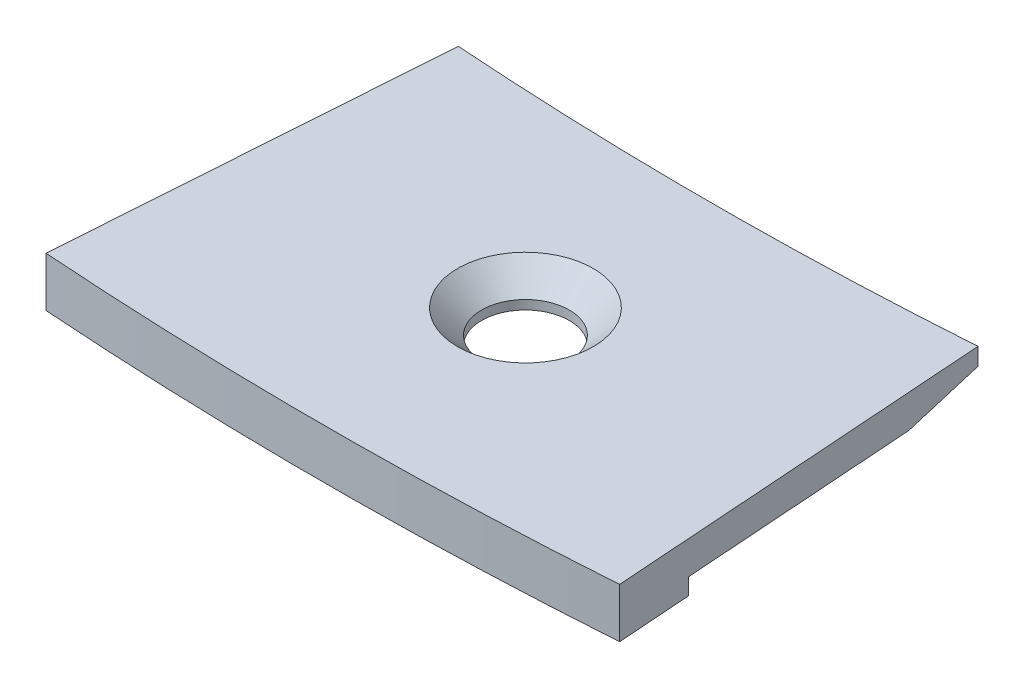
ISO-10303-21;
HEADER;
FILE_DESCRIPTION(('STEP AP214'),'2;1');
FILE_NAME('part.step','',(''),(''),'','','');
FILE_SCHEMA(('AUTOMOTIVE_DESIGN { 1 0 10303 214 1 1 1 1 }'));
ENDSEC;
DATA;
#1=APPLICATION_CONTEXT('core data for automotive mechanical design processes');
#2=APPLICATION_PROTOCOL_DEFINITION('international standard','automotive_design',2000,#1);
#3=PRODUCT_CONTEXT('',#1,'mechanical');
#4=PRODUCT('Part','Part','',(#3));
#5=PRODUCT_RELATED_PRODUCT_CATEGORY('part','',(#4));
#6=PRODUCT_DEFINITION_FORMATION('','',#4);
#7=PRODUCT_DEFINITION_CONTEXT('part definition',#1,'design');
#8=PRODUCT_DEFINITION('design','',#6,#7);
#9=PRODUCT_DEFINITION_SHAPE('','',#8);
#10=(LENGTH_UNIT() NAMED_UNIT(*) SI_UNIT(.MILLI.,.METRE.));
#11=(NAMED_UNIT(*) PLANE_ANGLE_UNIT() SI_UNIT($,.RADIAN.));
#12=(NAMED_UNIT(*) SI_UNIT($,.STERADIAN.) SOLID_ANGLE_UNIT());
#13=UNCERTAINTY_MEASURE_WITH_UNIT(LENGTH_MEASURE(1.E-05),#10,'distance_accuracy_value','');
#14=(GEOMETRIC_REPRESENTATION_CONTEXT(3) GLOBAL_UNCERTAINTY_ASSIGNED_CONTEXT((#13)) GLOBAL_UNIT_ASSIGNED_CONTEXT((#10,
#11,#12)) REPRESENTATION_CONTEXT('',''));
#15=CARTESIAN_POINT('',(0.,0.,0.));
#16=DIRECTION('',(0.,0.,1.));
#17=DIRECTION('',(1.,0.,0.));
#18=AXIS2_PLACEMENT_3D('',#15,#16,#17);
#19=CARTESIAN_POINT('',(-4.35114280077257E-12,0.,3.66381025475767E-12));
#20=DIRECTION('',(0.,-1.,0.));
#21=DIRECTION('',(0.,0.,-1.));
#22=AXIS2_PLACEMENT_3D('',#19,#20,#21);
#23=PLANE('',#22);
#24=CARTESIAN_POINT('',(0.,0.,236.25));
#25=DIRECTION('',(0.,1.,0.));
#26=DIRECTION('',(0.,0.,1.));
#27=AXIS2_PLACEMENT_3D('',#24,#25,#26);
#28=CIRCLE('',#27,2.65);
#29=CARTESIAN_POINT('',(0.,0.,238.9));
#30=VERTEX_POINT('',#29);
#31=EDGE_CURVE('E129',#30,#30,#28,.T.);
#32=ORIENTED_EDGE('',*,*,#31,.T.);
#33=EDGE_LOOP('',(#32));
#34=FACE_BOUND('',#33,.T.);
#35=CARTESIAN_POINT('',(0.,0.,0.));
#36=DIRECTION('',(0.,1.,0.));
#37=DIRECTION('',(0.,0.,1.));
#38=AXIS2_PLACEMENT_3D('',#35,#36,#37);
#39=CIRCLE('',#38,244.);
#40=CARTESIAN_POINT('',(-17.0205795935663,0.,243.405628263397));
#41=VERTEX_POINT('',#40);
#42=CARTESIAN_POINT('',(17.0205795935667,0.,243.405628263397));
#43=VERTEX_POINT('',#42);
#44=EDGE_CURVE('E53',#41,#43,#39,.T.);
#45=ORIENTED_EDGE('',*,*,#44,.F.);
#46=DIRECTION('',(-0.0697564737441075,0.,0.997564050259826));
#47=VECTOR('',#46,1.);
#48=CARTESIAN_POINT('',(-15.9846959584666,0.,228.591802117042));
#49=LINE('',#48,#47);
#50=CARTESIAN_POINT('',(-16.0195741953386,0.,229.090584142172));
#51=VERTEX_POINT('',#50);
#52=EDGE_CURVE('E133',#51,#41,#49,.T.);
#53=ORIENTED_EDGE('',*,*,#52,.F.);
#54=CARTESIAN_POINT('',(0.,0.,0.));
#55=DIRECTION('',(0.,-1.,0.));
#56=DIRECTION('',(0.,0.,-1.));
#57=AXIS2_PLACEMENT_3D('',#54,#55,#56);
#58=CIRCLE('',#57,229.650000000004);
#59=CARTESIAN_POINT('',(16.0195741953387,0.,229.090584142172));
#60=VERTEX_POINT('',#59);
#61=EDGE_CURVE('E46',#51,#60,#58,.F.);
#62=ORIENTED_EDGE('',*,*,#61,.T.);
#63=DIRECTION('',(-0.0697564737441094,0.,-0.997564050259825));
#64=VECTOR('',#63,1.);
#65=CARTESIAN_POINT('',(15.9846959584666,0.,228.591802117042));
#66=LINE('',#65,#64);
#67=EDGE_CURVE('E59',#43,#60,#66,.T.);
#68=ORIENTED_EDGE('',*,*,#67,.F.);
#69=EDGE_LOOP('',(#45,#53,#62,#68));
#70=FACE_BOUND('',#69,.T.);
#71=ADVANCED_FACE('F37',(#34,#70),#23,.T.);
#72=CARTESIAN_POINT('',(-4.35114280077257E-12,2.,3.66381025475767E-12));
#73=DIRECTION('',(0.,-1.,0.));
#74=DIRECTION('',(0.,0.,-1.));
#75=AXIS2_PLACEMENT_3D('',#72,#73,#74);
#76=PLANE('',#75);
#77=CARTESIAN_POINT('',(0.,2.,236.25));
#78=DIRECTION('',(0.,1.,0.));
#79=DIRECTION('',(0.,0.,1.));
#80=AXIS2_PLACEMENT_3D('',#77,#78,#79);
#81=CIRCLE('',#80,4.1);
#82=CARTESIAN_POINT('',(0.,2.,240.35));
#83=VERTEX_POINT('',#82);
#84=EDGE_CURVE('E170',#83,#83,#81,.T.);
#85=ORIENTED_EDGE('',*,*,#84,.F.);
#86=EDGE_LOOP('',(#85));
#87=FACE_BOUND('',#86,.T.);
#88=DIRECTION('',(-0.0697564737441094,0.,-0.997564050259825));
#89=VECTOR('',#88,1.);
#90=CARTESIAN_POINT('',(15.9846959584666,2.,228.591802117042));
#91=LINE('',#90,#89);
#92=CARTESIAN_POINT('',(17.3344837254152,2.,247.894666489571));
#93=VERTEX_POINT('',#92);
#94=CARTESIAN_POINT('',(15.7056700634855,2.,224.601545916003));
#95=VERTEX_POINT('',#94);
#96=EDGE_CURVE('E138',#93,#95,#91,.T.);
#97=ORIENTED_EDGE('',*,*,#96,.T.);
#98=CARTESIAN_POINT('',(0.,2.,0.));
#99=DIRECTION('',(0.,-1.,0.));
#100=DIRECTION('',(0.,0.,-1.));
#101=AXIS2_PLACEMENT_3D('',#98,#99,#100);
#102=CIRCLE('',#101,225.150000000004);
#103=CARTESIAN_POINT('',(-15.7056700634945,2.,224.601545916003));
#104=VERTEX_POINT('',#103);
#105=EDGE_CURVE('E118',#95,#104,#102,.T.);
#106=ORIENTED_EDGE('',*,*,#105,.T.);
#107=DIRECTION('',(-0.0697564737441075,0.,0.997564050259826));
#108=VECTOR('',#107,1.);
#109=CARTESIAN_POINT('',(-15.9846959584666,2.,228.591802117042));
#110=LINE('',#109,#108);
#111=CARTESIAN_POINT('',(-17.3344837254152,2.,247.894666489571));
#112=VERTEX_POINT('',#111);
#113=EDGE_CURVE('E134',#104,#112,#110,.T.);
#114=ORIENTED_EDGE('',*,*,#113,.T.);
#115=CARTESIAN_POINT('',(-4.6074255521944E-12,2.,0.));
#116=DIRECTION('',(0.,1.,0.));
#117=DIRECTION('',(0.,0.,-1.));
#118=AXIS2_PLACEMENT_3D('',#115,#116,#117);
#119=CIRCLE('',#118,248.500000000005);
#120=EDGE_CURVE('E136',#112,#93,#119,.T.);
#121=ORIENTED_EDGE('',*,*,#120,.T.);
#122=EDGE_LOOP('',(#97,#106,#114,#121));
#123=FACE_BOUND('',#122,.T.);
#124=ADVANCED_FACE('F161',(#87,#123),#76,.F.);
#125=CARTESIAN_POINT('',(-15.9846959584666,2.,228.591802117042));
#126=DIRECTION('',(0.997564050259826,0.,0.0697564737441075));
#127=DIRECTION('',(0.0697564737441075,0.,-0.997564050259826));
#128=AXIS2_PLACEMENT_3D('',#125,#126,#127);
#129=PLANE('',#128);
#130=DIRECTION('',(0.,1.,0.));
#131=VECTOR('',#130,1.);
#132=CARTESIAN_POINT('',(-15.7056700634945,0.,224.601545916003));
#133=LINE('',#132,#131);
#134=CARTESIAN_POINT('',(-15.7056700634945,0.956504527515105,224.601545916003));
#135=VERTEX_POINT('',#134);
#136=EDGE_CURVE('E127',#135,#104,#133,.T.);
#137=ORIENTED_EDGE('',*,*,#136,.F.);
#138=DIRECTION('',(-0.0682321274284495,-0.207911690817758,0.975764882339946));
#139=VECTOR('',#138,1.);
#140=CARTESIAN_POINT('',(-4.09781873540611E-12,48.813614387521,-2.86547400089263E-13));
#141=LINE('',#140,#139);
#142=EDGE_CURVE('E149',#135,#51,#141,.T.);
#143=ORIENTED_EDGE('',*,*,#142,.T.);
#144=ORIENTED_EDGE('',*,*,#52,.T.);
#145=DIRECTION('',(0.,1.,0.));
#146=VECTOR('',#145,1.);
#147=CARTESIAN_POINT('',(-17.0205795935663,-1.,243.405628263397));
#148=LINE('',#147,#146);
#149=CARTESIAN_POINT('',(-17.0205795935663,-1.,243.405628263397));
#150=VERTEX_POINT('',#149);
#151=EDGE_CURVE('E119',#150,#41,#148,.T.);
#152=ORIENTED_EDGE('',*,*,#151,.F.);
#153=DIRECTION('',(0.0697564737441093,0.,-0.997564050259826));
#154=VECTOR('',#153,1.);
#155=CARTESIAN_POINT('',(-17.3344837254152,-1.,247.894666489571));
#156=LINE('',#155,#154);
#157=CARTESIAN_POINT('',(-17.3344837254152,-1.,247.894666489571));
#158=VERTEX_POINT('',#157);
#159=EDGE_CURVE('E112',#158,#150,#156,.T.);
#160=ORIENTED_EDGE('',*,*,#159,.F.);
#161=DIRECTION('',(0.,-1.,0.));
#162=VECTOR('',#161,1.);
#163=CARTESIAN_POINT('',(-17.3344837254152,2.,247.894666489571));
#164=LINE('',#163,#162);
#165=EDGE_CURVE('E144',#112,#158,#164,.T.);
#166=ORIENTED_EDGE('',*,*,#165,.F.);
#167=ORIENTED_EDGE('',*,*,#113,.F.);
#168=EDGE_LOOP('',(#137,#143,#144,#152,#160,#166,#167));
#169=FACE_BOUND('',#168,.T.);
#170=ADVANCED_FACE('F181',(#169),#129,.F.);
#171=CARTESIAN_POINT('',(-4.6074255521944E-12,2.,0.));
#172=DIRECTION('',(0.,-1.,0.));
#173=DIRECTION('',(0.,0.,-1.));
#174=AXIS2_PLACEMENT_3D('',#171,#172,#173);
#175=CYLINDRICAL_SURFACE('',#174,248.500000000005);
#176=ORIENTED_EDGE('',*,*,#165,.T.);
#177=CARTESIAN_POINT('',(0.,-1.,0.));
#178=DIRECTION('',(0.,-1.,0.));
#179=DIRECTION('',(0.,0.,1.));
#180=AXIS2_PLACEMENT_3D('',#177,#178,#179);
#181=CIRCLE('',#180,248.500000000005);
#182=CARTESIAN_POINT('',(17.3344837254153,-1.,247.894666489571));
#183=VERTEX_POINT('',#182);
#184=EDGE_CURVE('E106',#183,#158,#181,.T.);
#185=ORIENTED_EDGE('',*,*,#184,.F.);
#186=DIRECTION('',(0.,-1.,0.));
#187=VECTOR('',#186,1.);
#188=CARTESIAN_POINT('',(17.3344837254152,2.,247.894666489571));
#189=LINE('',#188,#187);
#190=EDGE_CURVE('E102',#93,#183,#189,.T.);
#191=ORIENTED_EDGE('',*,*,#190,.F.);
#192=ORIENTED_EDGE('',*,*,#120,.F.);
#193=EDGE_LOOP('',(#176,#185,#191,#192));
#194=FACE_BOUND('',#193,.T.);
#195=ADVANCED_FACE('F165',(#194),#175,.T.);
#196=CARTESIAN_POINT('',(15.9846959584666,2.,228.591802117042));
#197=DIRECTION('',(-0.997564050259825,0.,0.0697564737441094));
#198=DIRECTION('',(0.0697564737441094,0.,0.997564050259825));
#199=AXIS2_PLACEMENT_3D('',#196,#197,#198);
#200=PLANE('',#199);
#201=ORIENTED_EDGE('',*,*,#190,.T.);
#202=DIRECTION('',(0.0697564737440505,0.,0.99756405025983));
#203=VECTOR('',#202,1.);
#204=CARTESIAN_POINT('',(17.3344837254152,-1.,247.894666489571));
#205=LINE('',#204,#203);
#206=CARTESIAN_POINT('',(17.0205795935667,-1.,243.405628263397));
#207=VERTEX_POINT('',#206);
#208=EDGE_CURVE('E95',#207,#183,#205,.T.);
#209=ORIENTED_EDGE('',*,*,#208,.F.);
#210=DIRECTION('',(0.,1.,0.));
#211=VECTOR('',#210,1.);
#212=CARTESIAN_POINT('',(17.0205795935667,-1.,243.405628263397));
#213=LINE('',#212,#211);
#214=EDGE_CURVE('E99',#207,#43,#213,.T.);
#215=ORIENTED_EDGE('',*,*,#214,.T.);
#216=ORIENTED_EDGE('',*,*,#67,.T.);
#217=DIRECTION('',(-0.0682321274284514,0.207911690817758,-0.975764882339946));
#218=VECTOR('',#217,1.);
#219=CARTESIAN_POINT('',(3.74479718894375E-12,48.813614387521,-2.61861728797796E-13));
#220=LINE('',#219,#218);
#221=CARTESIAN_POINT('',(15.7056700634855,0.956504527515105,224.601545916003));
#222=VERTEX_POINT('',#221);
#223=EDGE_CURVE('E11',#60,#222,#220,.T.);
#224=ORIENTED_EDGE('',*,*,#223,.T.);
#225=DIRECTION('',(0.,1.,0.));
#226=VECTOR('',#225,1.);
#227=CARTESIAN_POINT('',(15.7056700634855,0.,224.601545916003));
#228=LINE('',#227,#226);
#229=EDGE_CURVE('E122',#222,#95,#228,.T.);
#230=ORIENTED_EDGE('',*,*,#229,.T.);
#231=ORIENTED_EDGE('',*,*,#96,.F.);
#232=EDGE_LOOP('',(#201,#209,#215,#216,#224,#230,#231));
#233=FACE_BOUND('',#232,.T.);
#234=ADVANCED_FACE('F97',(#233),#200,.F.);
#235=CARTESIAN_POINT('',(0.,2.,236.25));
#236=DIRECTION('',(0.,-1.,0.));
#237=DIRECTION('',(0.,0.,-1.));
#238=AXIS2_PLACEMENT_3D('',#235,#236,#237);
#239=CYLINDRICAL_SURFACE('',#238,2.65);
#240=CARTESIAN_POINT('',(0.,0.550000000000005,236.25));
#241=DIRECTION('',(0.,1.,0.));
#242=DIRECTION('',(0.,0.,1.));
#243=AXIS2_PLACEMENT_3D('',#240,#241,#242);
#244=CIRCLE('',#243,2.65);
#245=CARTESIAN_POINT('',(0.,0.550000000000005,238.9));
#246=VERTEX_POINT('',#245);
#247=EDGE_CURVE('E168',#246,#246,#244,.F.);
#248=ORIENTED_EDGE('',*,*,#247,.F.);
#249=EDGE_LOOP('',(#248));
#250=FACE_BOUND('',#249,.T.);
#251=ORIENTED_EDGE('',*,*,#31,.F.);
#252=EDGE_LOOP('',(#251));
#253=FACE_BOUND('',#252,.T.);
#254=ADVANCED_FACE('F191',(#250,#253),#239,.F.);
#255=CARTESIAN_POINT('',(0.,0.,0.));
#256=DIRECTION('',(0.,1.,0.));
#257=DIRECTION('',(0.,0.,1.));
#258=AXIS2_PLACEMENT_3D('',#255,#256,#257);
#259=CYLINDRICAL_SURFACE('',#258,225.150000000004);
#260=ORIENTED_EDGE('',*,*,#229,.F.);
#261=CARTESIAN_POINT('',(0.,0.956504527515105,0.));
#262=DIRECTION('',(0.,-1.,0.));
#263=DIRECTION('',(0.,0.,-1.));
#264=AXIS2_PLACEMENT_3D('',#261,#262,#263);
#265=CIRCLE('',#264,225.150000000004);
#266=EDGE_CURVE('E146',#222,#135,#265,.T.);
#267=ORIENTED_EDGE('',*,*,#266,.T.);
#268=ORIENTED_EDGE('',*,*,#136,.T.);
#269=ORIENTED_EDGE('',*,*,#105,.F.);
#270=EDGE_LOOP('',(#260,#267,#268,#269));
#271=FACE_BOUND('',#270,.T.);
#272=ADVANCED_FACE('F157',(#271),#259,.F.);
#273=CARTESIAN_POINT('',(0.,0.956504527515105,0.));
#274=DIRECTION('',(0.,-1.,0.));
#275=DIRECTION('',(0.,0.,-1.));
#276=AXIS2_PLACEMENT_3D('',#273,#274,#275);
#277=CONICAL_SURFACE('',#276,225.150000000004,1.36135681655558);
#278=ORIENTED_EDGE('',*,*,#223,.F.);
#279=ORIENTED_EDGE('',*,*,#61,.F.);
#280=ORIENTED_EDGE('',*,*,#142,.F.);
#281=ORIENTED_EDGE('',*,*,#266,.F.);
#282=EDGE_LOOP('',(#278,#279,#280,#281));
#283=FACE_BOUND('',#282,.T.);
#284=ADVANCED_FACE('F40',(#283),#277,.F.);
#285=CARTESIAN_POINT('',(0.,-1.,0.));
#286=DIRECTION('',(0.,1.,0.));
#287=DIRECTION('',(0.,0.,1.));
#288=AXIS2_PLACEMENT_3D('',#285,#286,#287);
#289=CYLINDRICAL_SURFACE('',#288,244.);
#290=ORIENTED_EDGE('',*,*,#44,.T.);
#291=ORIENTED_EDGE('',*,*,#214,.F.);
#292=CARTESIAN_POINT('',(0.,-1.,0.));
#293=DIRECTION('',(0.,1.,0.));
#294=DIRECTION('',(0.,0.,1.));
#295=AXIS2_PLACEMENT_3D('',#292,#293,#294);
#296=CIRCLE('',#295,244.);
#297=EDGE_CURVE('E107',#150,#207,#296,.T.);
#298=ORIENTED_EDGE('',*,*,#297,.F.);
#299=ORIENTED_EDGE('',*,*,#151,.T.);
#300=EDGE_LOOP('',(#290,#291,#298,#299));
#301=FACE_BOUND('',#300,.T.);
#302=ADVANCED_FACE('F117',(#301),#289,.F.);
#303=CARTESIAN_POINT('',(0.,-1.,0.));
#304=DIRECTION('',(0.,1.,0.));
#305=DIRECTION('',(0.,0.,1.));
#306=AXIS2_PLACEMENT_3D('',#303,#304,#305);
#307=PLANE('',#306);
#308=ORIENTED_EDGE('',*,*,#297,.T.);
#309=ORIENTED_EDGE('',*,*,#208,.T.);
#310=ORIENTED_EDGE('',*,*,#184,.T.);
#311=ORIENTED_EDGE('',*,*,#159,.T.);
#312=EDGE_LOOP('',(#308,#309,#310,#311));
#313=FACE_BOUND('',#312,.T.);
#314=ADVANCED_FACE('F110',(#313),#307,.F.);
#315=CARTESIAN_POINT('',(0.,2.,236.25));
#316=DIRECTION('',(0.,1.,0.));
#317=DIRECTION('',(0.,0.,1.));
#318=AXIS2_PLACEMENT_3D('',#315,#316,#317);
#319=CONICAL_SURFACE('',#318,4.1,0.785398163397449);
#320=ORIENTED_EDGE('',*,*,#247,.T.);
#321=EDGE_LOOP('',(#320));
#322=FACE_BOUND('',#321,.T.);
#323=ORIENTED_EDGE('',*,*,#84,.T.);
#324=EDGE_LOOP('',(#323));
#325=FACE_BOUND('',#324,.T.);
#326=ADVANCED_FACE('F178',(#322,#325),#319,.F.);
#327=CLOSED_SHELL('',(#71,#124,#170,#195,#234,#254,#272,#284,#302,#314,#326));
#328=MANIFOLD_SOLID_BREP('B2',#327);
#329=ADVANCED_BREP_SHAPE_REPRESENTATION('',(#18,#328),#14);
#330=SHAPE_DEFINITION_REPRESENTATION(#9,#329);
ENDSEC;
END-ISO-10303-21;
